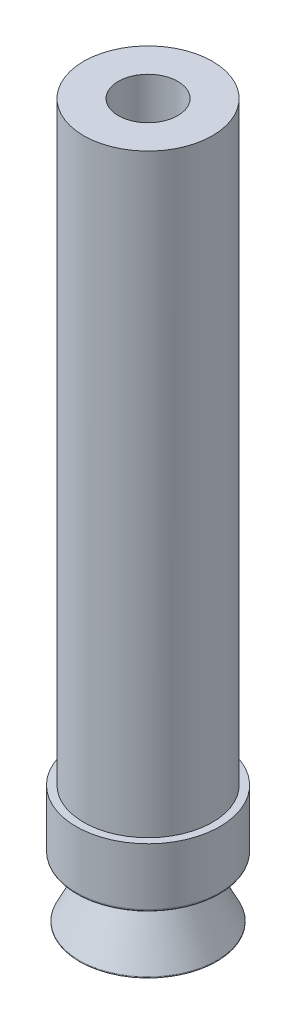
ISO-10303-21;
HEADER;
FILE_DESCRIPTION(('STEP AP214'),'2;1');
FILE_NAME('part.step','',(''),(''),'','','');
FILE_SCHEMA(('AUTOMOTIVE_DESIGN { 1 0 10303 214 1 1 1 1 }'));
ENDSEC;
DATA;
#1=APPLICATION_CONTEXT('core data for automotive mechanical design processes');
#2=APPLICATION_PROTOCOL_DEFINITION('international standard','automotive_design',2000,#1);
#3=PRODUCT_CONTEXT('',#1,'mechanical');
#4=PRODUCT('Part','Part','',(#3));
#5=PRODUCT_RELATED_PRODUCT_CATEGORY('part','',(#4));
#6=PRODUCT_DEFINITION_FORMATION('','',#4);
#7=PRODUCT_DEFINITION_CONTEXT('part definition',#1,'design');
#8=PRODUCT_DEFINITION('design','',#6,#7);
#9=PRODUCT_DEFINITION_SHAPE('','',#8);
#10=(LENGTH_UNIT() NAMED_UNIT(*) SI_UNIT(.MILLI.,.METRE.));
#11=(NAMED_UNIT(*) PLANE_ANGLE_UNIT() SI_UNIT($,.RADIAN.));
#12=(NAMED_UNIT(*) SI_UNIT($,.STERADIAN.) SOLID_ANGLE_UNIT());
#13=UNCERTAINTY_MEASURE_WITH_UNIT(LENGTH_MEASURE(1.E-05),#10,'distance_accuracy_value','');
#14=(GEOMETRIC_REPRESENTATION_CONTEXT(3) GLOBAL_UNCERTAINTY_ASSIGNED_CONTEXT((#13)) GLOBAL_UNIT_ASSIGNED_CONTEXT((#10,
#11,#12)) REPRESENTATION_CONTEXT('',''));
#15=CARTESIAN_POINT('',(0.,0.,0.));
#16=DIRECTION('',(0.,0.,1.));
#17=DIRECTION('',(1.,0.,0.));
#18=AXIS2_PLACEMENT_3D('',#15,#16,#17);
#19=CARTESIAN_POINT('',(0.,-6.,0.));
#20=DIRECTION('',(0.,-1.,0.));
#21=DIRECTION('',(0.,0.,-1.));
#22=AXIS2_PLACEMENT_3D('',#19,#20,#21);
#23=PLANE('',#22);
#24=CARTESIAN_POINT('',(0.,-6.,0.));
#25=DIRECTION('',(0.,-1.,0.));
#26=DIRECTION('',(0.,0.,-1.));
#27=AXIS2_PLACEMENT_3D('',#24,#25,#26);
#28=CIRCLE('',#27,4.40450849718748);
#29=CARTESIAN_POINT('',(0.,-6.,-4.40450849718748));
#30=VERTEX_POINT('',#29);
#31=EDGE_CURVE('E42',#30,#30,#28,.F.);
#32=ORIENTED_EDGE('',*,*,#31,.T.);
#33=EDGE_LOOP('',(#32));
#34=FACE_BOUND('',#33,.T.);
#35=CARTESIAN_POINT('',(0.,-6.,0.));
#36=DIRECTION('',(0.,-1.,0.));
#37=DIRECTION('',(0.,0.,-1.));
#38=AXIS2_PLACEMENT_3D('',#35,#36,#37);
#39=CIRCLE('',#38,7.);
#40=CARTESIAN_POINT('',(0.,-6.,-7.));
#41=VERTEX_POINT('',#40);
#42=EDGE_CURVE('E50',#41,#41,#39,.T.);
#43=ORIENTED_EDGE('',*,*,#42,.T.);
#44=EDGE_LOOP('',(#43));
#45=FACE_BOUND('',#44,.T.);
#46=ADVANCED_FACE('F35',(#34,#45),#23,.T.);
#47=CARTESIAN_POINT('',(0.,60.,0.));
#48=DIRECTION('',(0.,-1.,0.));
#49=DIRECTION('',(0.,0.,-1.));
#50=AXIS2_PLACEMENT_3D('',#47,#48,#49);
#51=CYLINDRICAL_SURFACE('',#50,6.5);
#52=CARTESIAN_POINT('',(0.,60.,0.));
#53=DIRECTION('',(0.,1.,0.));
#54=DIRECTION('',(0.,0.,1.));
#55=AXIS2_PLACEMENT_3D('',#52,#53,#54);
#56=CIRCLE('',#55,6.5);
#57=CARTESIAN_POINT('',(0.,60.,6.5));
#58=VERTEX_POINT('',#57);
#59=EDGE_CURVE('E67',#58,#58,#56,.T.);
#60=ORIENTED_EDGE('',*,*,#59,.F.);
#61=EDGE_LOOP('',(#60));
#62=FACE_BOUND('',#61,.T.);
#63=CARTESIAN_POINT('',(0.,0.,0.));
#64=DIRECTION('',(0.,-1.,0.));
#65=DIRECTION('',(0.,0.,-1.));
#66=AXIS2_PLACEMENT_3D('',#63,#64,#65);
#67=CIRCLE('',#66,6.5);
#68=CARTESIAN_POINT('',(0.,0.,-6.5));
#69=VERTEX_POINT('',#68);
#70=EDGE_CURVE('E74',#69,#69,#67,.T.);
#71=ORIENTED_EDGE('',*,*,#70,.F.);
#72=EDGE_LOOP('',(#71));
#73=FACE_BOUND('',#72,.T.);
#74=ADVANCED_FACE('F107',(#62,#73),#51,.T.);
#75=CARTESIAN_POINT('',(0.,60.,0.));
#76=DIRECTION('',(0.,1.,0.));
#77=DIRECTION('',(0.,0.,1.));
#78=AXIS2_PLACEMENT_3D('',#75,#76,#77);
#79=PLANE('',#78);
#80=CARTESIAN_POINT('',(0.,60.,0.));
#81=DIRECTION('',(0.,1.,0.));
#82=DIRECTION('',(0.,0.,1.));
#83=AXIS2_PLACEMENT_3D('',#80,#81,#82);
#84=CIRCLE('',#83,3.);
#85=CARTESIAN_POINT('',(0.,60.,3.));
#86=VERTEX_POINT('',#85);
#87=EDGE_CURVE('E71',#86,#86,#84,.T.);
#88=ORIENTED_EDGE('',*,*,#87,.F.);
#89=EDGE_LOOP('',(#88));
#90=FACE_BOUND('',#89,.T.);
#91=ORIENTED_EDGE('',*,*,#59,.T.);
#92=EDGE_LOOP('',(#91));
#93=FACE_BOUND('',#92,.T.);
#94=ADVANCED_FACE('F113',(#90,#93),#79,.T.);
#95=CARTESIAN_POINT('',(0.,7.5,0.));
#96=DIRECTION('',(0.,1.,0.));
#97=DIRECTION('',(0.,0.,1.));
#98=AXIS2_PLACEMENT_3D('',#95,#96,#97);
#99=CYLINDRICAL_SURFACE('',#98,3.);
#100=CARTESIAN_POINT('',(0.,7.5,0.));
#101=DIRECTION('',(0.,1.,0.));
#102=DIRECTION('',(0.,0.,1.));
#103=AXIS2_PLACEMENT_3D('',#100,#101,#102);
#104=CIRCLE('',#103,3.);
#105=CARTESIAN_POINT('',(0.,7.5,3.));
#106=VERTEX_POINT('',#105);
#107=EDGE_CURVE('E70',#106,#106,#104,.T.);
#108=ORIENTED_EDGE('',*,*,#107,.F.);
#109=EDGE_LOOP('',(#108));
#110=FACE_BOUND('',#109,.T.);
#111=ORIENTED_EDGE('',*,*,#87,.T.);
#112=EDGE_LOOP('',(#111));
#113=FACE_BOUND('',#112,.T.);
#114=ADVANCED_FACE('F132',(#110,#113),#99,.F.);
#115=CARTESIAN_POINT('',(0.,7.5,0.));
#116=DIRECTION('',(0.,1.,0.));
#117=DIRECTION('',(0.,0.,1.));
#118=AXIS2_PLACEMENT_3D('',#115,#116,#117);
#119=PLANE('',#118);
#120=ORIENTED_EDGE('',*,*,#107,.T.);
#121=EDGE_LOOP('',(#120));
#122=FACE_BOUND('',#121,.T.);
#123=ADVANCED_FACE('F136',(#122),#119,.T.);
#124=CARTESIAN_POINT('',(0.,0.,0.));
#125=DIRECTION('',(0.,-1.,0.));
#126=DIRECTION('',(0.,0.,-1.));
#127=AXIS2_PLACEMENT_3D('',#124,#125,#126);
#128=PLANE('',#127);
#129=CARTESIAN_POINT('',(0.,0.,0.));
#130=DIRECTION('',(0.,-1.,0.));
#131=DIRECTION('',(0.,0.,-1.));
#132=AXIS2_PLACEMENT_3D('',#129,#130,#131);
#133=CIRCLE('',#132,7.25);
#134=CARTESIAN_POINT('',(0.,0.,-7.25));
#135=VERTEX_POINT('',#134);
#136=EDGE_CURVE('E79',#135,#135,#133,.T.);
#137=ORIENTED_EDGE('',*,*,#136,.F.);
#138=EDGE_LOOP('',(#137));
#139=FACE_BOUND('',#138,.T.);
#140=ORIENTED_EDGE('',*,*,#70,.T.);
#141=EDGE_LOOP('',(#140));
#142=FACE_BOUND('',#141,.T.);
#143=ADVANCED_FACE('F140',(#139,#142),#128,.F.);
#144=CARTESIAN_POINT('',(0.,-6.,0.));
#145=DIRECTION('',(0.,1.,0.));
#146=DIRECTION('',(0.,0.,1.));
#147=AXIS2_PLACEMENT_3D('',#144,#145,#146);
#148=CYLINDRICAL_SURFACE('',#147,7.25);
#149=CARTESIAN_POINT('',(0.,-5.75,0.));
#150=DIRECTION('',(0.,-1.,0.));
#151=DIRECTION('',(0.,0.,-1.));
#152=AXIS2_PLACEMENT_3D('',#149,#150,#151);
#153=CIRCLE('',#152,7.25);
#154=CARTESIAN_POINT('',(0.,-5.75,-7.25));
#155=VERTEX_POINT('',#154);
#156=EDGE_CURVE('E46',#155,#155,#153,.F.);
#157=ORIENTED_EDGE('',*,*,#156,.T.);
#158=EDGE_LOOP('',(#157));
#159=FACE_BOUND('',#158,.T.);
#160=ORIENTED_EDGE('',*,*,#136,.T.);
#161=EDGE_LOOP('',(#160));
#162=FACE_BOUND('',#161,.T.);
#163=ADVANCED_FACE('F142',(#159,#162),#148,.T.);
#164=CARTESIAN_POINT('',(0.,-12.,0.));
#165=DIRECTION('',(0.,-1.,0.));
#166=DIRECTION('',(0.,0.,-1.));
#167=AXIS2_PLACEMENT_3D('',#164,#165,#166);
#168=CONICAL_SURFACE('',#167,7.,0.463647609000806);
#169=CARTESIAN_POINT('',(0.,-6.36180339887499,0.));
#170=DIRECTION('',(0.,1.,0.));
#171=DIRECTION('',(0.,0.,1.));
#172=AXIS2_PLACEMENT_3D('',#169,#170,#171);
#173=CIRCLE('',#172,4.1809016994375);
#174=CARTESIAN_POINT('',(0.,-6.36180339887499,4.1809016994375));
#175=VERTEX_POINT('',#174);
#176=EDGE_CURVE('E10',#175,#175,#173,.F.);
#177=ORIENTED_EDGE('',*,*,#176,.T.);
#178=EDGE_LOOP('',(#177));
#179=FACE_BOUND('',#178,.T.);
#180=CARTESIAN_POINT('',(0.,-11.85527864045,0.));
#181=DIRECTION('',(0.,1.,0.));
#182=DIRECTION('',(0.,0.,1.));
#183=AXIS2_PLACEMENT_3D('',#180,#181,#182);
#184=CIRCLE('',#183,6.927639320225);
#185=CARTESIAN_POINT('',(0.,-11.85527864045,6.927639320225));
#186=VERTEX_POINT('',#185);
#187=EDGE_CURVE('E55',#186,#186,#184,.T.);
#188=ORIENTED_EDGE('',*,*,#187,.T.);
#189=EDGE_LOOP('',(#188));
#190=FACE_BOUND('',#189,.T.);
#191=ADVANCED_FACE('F144',(#179,#190),#168,.T.);
#192=CARTESIAN_POINT('',(0.,-12.,-6.75));
#193=DIRECTION('',(0.,1.,0.));
#194=DIRECTION('',(0.,0.,1.));
#195=AXIS2_PLACEMENT_3D('',#192,#193,#194);
#196=PLANE('',#195);
#197=CARTESIAN_POINT('',(0.,-12.,0.));
#198=DIRECTION('',(0.,1.,0.));
#199=DIRECTION('',(0.,0.,1.));
#200=AXIS2_PLACEMENT_3D('',#197,#198,#199);
#201=CIRCLE('',#200,6.79267308448829);
#202=CARTESIAN_POINT('',(0.,-12.,6.79267308448829));
#203=VERTEX_POINT('',#202);
#204=EDGE_CURVE('E61',#203,#203,#201,.T.);
#205=ORIENTED_EDGE('',*,*,#204,.T.);
#206=EDGE_LOOP('',(#205));
#207=FACE_BOUND('',#206,.T.);
#208=CARTESIAN_POINT('',(0.,-12.,0.));
#209=DIRECTION('',(0.,1.,0.));
#210=DIRECTION('',(0.,0.,1.));
#211=AXIS2_PLACEMENT_3D('',#208,#209,#210);
#212=CIRCLE('',#211,6.83819660112501);
#213=CARTESIAN_POINT('',(0.,-12.,6.83819660112501));
#214=VERTEX_POINT('',#213);
#215=EDGE_CURVE('E64',#214,#214,#212,.F.);
#216=ORIENTED_EDGE('',*,*,#215,.T.);
#217=EDGE_LOOP('',(#216));
#218=FACE_BOUND('',#217,.T.);
#219=ADVANCED_FACE('F101',(#207,#218),#196,.F.);
#220=CARTESIAN_POINT('',(0.,-6.,0.));
#221=DIRECTION('',(0.,-1.,0.));
#222=DIRECTION('',(0.,0.,-1.));
#223=AXIS2_PLACEMENT_3D('',#220,#221,#222);
#224=CONICAL_SURFACE('',#223,1.,0.764124777373387);
#225=CARTESIAN_POINT('',(0.,-11.9691905363236,0.));
#226=DIRECTION('',(0.,1.,0.));
#227=DIRECTION('',(0.,0.,1.));
#228=AXIS2_PLACEMENT_3D('',#225,#226,#227);
#229=CIRCLE('',#228,6.72047426397675);
#230=CARTESIAN_POINT('',(0.,-11.9691905363236,-6.72047426397675));
#231=VERTEX_POINT('',#230);
#232=EDGE_CURVE('E58',#231,#231,#229,.F.);
#233=CARTESIAN_POINT('',(0.,-6.,0.));
#234=DIRECTION('',(0.,1.,0.));
#235=DIRECTION('',(0.,0.,1.));
#236=AXIS2_PLACEMENT_3D('',#233,#234,#235);
#237=CIRCLE('',#236,1.);
#238=CARTESIAN_POINT('',(0.,-6.,-1.));
#239=VERTEX_POINT('',#238);
#240=EDGE_CURVE('E82',#239,#239,#237,.T.);
#241=CARTESIAN_POINT('',(0.,-11.9691905363236,-6.72047426397675));
#242=CARTESIAN_POINT('',(0.,-11.9070114682369,-6.66088599039366));
#243=CARTESIAN_POINT('',(0.,-11.8448324001502,-6.60129771681057));
#244=CARTESIAN_POINT('',(0.,-11.7204742639767,-6.48212116964438));
#245=CARTESIAN_POINT('',(0.,-11.65829519589,-6.42253289606129));
#246=CARTESIAN_POINT('',(0.,-11.5339370597166,-6.30335634889511));
#247=CARTESIAN_POINT('',(0.,-11.4717579916299,-6.24376807531202));
#248=CARTESIAN_POINT('',(0.,-11.3473998554565,-6.12459152814584));
#249=CARTESIAN_POINT('',(0.,-11.2852207873698,-6.06500325456275));
#250=CARTESIAN_POINT('',(0.,-11.1608626511964,-5.94582670739656));
#251=CARTESIAN_POINT('',(0.,-11.0986835831097,-5.88623843381347));
#252=CARTESIAN_POINT('',(0.,-10.9743254469363,-5.76706188664729));
#253=CARTESIAN_POINT('',(0.,-10.9121463788496,-5.7074736130642));
#254=CARTESIAN_POINT('',(0.,-10.7877882426762,-5.58829706589802));
#255=CARTESIAN_POINT('',(0.,-10.7256091745895,-5.52870879231493));
#256=CARTESIAN_POINT('',(0.,-10.6012510384161,-5.40953224514874));
#257=CARTESIAN_POINT('',(0.,-10.5390719703294,-5.34994397156565));
#258=CARTESIAN_POINT('',(0.,-10.414713834156,-5.23076742439947));
#259=CARTESIAN_POINT('',(0.,-10.3525347660693,-5.17117915081638));
#260=CARTESIAN_POINT('',(0.,-10.2281766298959,-5.0520026036502));
#261=CARTESIAN_POINT('',(0.,-10.1659975618092,-4.9924143300671));
#262=CARTESIAN_POINT('',(0.,-10.0416394256357,-4.87323778290092));
#263=CARTESIAN_POINT('',(0.,-9.97946035754904,-4.81364950931783));
#264=CARTESIAN_POINT('',(0.,-9.85510222137563,-4.69447296215165));
#265=CARTESIAN_POINT('',(0.,-9.79292315328893,-4.63488468856856));
#266=CARTESIAN_POINT('',(0.,-9.66856501711552,-4.51570814140238));
#267=CARTESIAN_POINT('',(0.,-9.60638594902882,-4.45611986781929));
#268=CARTESIAN_POINT('',(0.,-9.48202781285541,-4.3369433206531));
#269=CARTESIAN_POINT('',(0.,-9.41984874476871,-4.27735504707001));
#270=CARTESIAN_POINT('',(0.,-9.2954906085953,-4.15817849990383));
#271=CARTESIAN_POINT('',(0.,-9.23331154050859,-4.09859022632074));
#272=CARTESIAN_POINT('',(0.,-9.10895340433519,-3.97941367915456));
#273=CARTESIAN_POINT('',(0.,-9.04677433624848,-3.91982540557147));
#274=CARTESIAN_POINT('',(0.,-8.92241620007507,-3.80064885840528));
#275=CARTESIAN_POINT('',(0.,-8.86023713198837,-3.74106058482219));
#276=CARTESIAN_POINT('',(0.,-8.73587899581496,-3.62188403765601));
#277=CARTESIAN_POINT('',(0.,-8.67369992772826,-3.56229576407292));
#278=CARTESIAN_POINT('',(0.,-8.54934179155485,-3.44311921690674));
#279=CARTESIAN_POINT('',(0.,-8.48716272346815,-3.38353094332364));
#280=CARTESIAN_POINT('',(0.,-8.36280458729474,-3.26435439615746));
#281=CARTESIAN_POINT('',(0.,-8.30062551920804,-3.20476612257437));
#282=CARTESIAN_POINT('',(0.,-8.17626738303463,-3.08558957540819));
#283=CARTESIAN_POINT('',(0.,-8.11408831494793,-3.0260013018251));
#284=CARTESIAN_POINT('',(0.,-7.98973017877452,-2.90682475465892));
#285=CARTESIAN_POINT('',(0.,-7.92755111068782,-2.84723648107582));
#286=CARTESIAN_POINT('',(0.,-7.80319297451441,-2.72805993390964));
#287=CARTESIAN_POINT('',(0.,-7.7410139064277,-2.66847166032655));
#288=CARTESIAN_POINT('',(0.,-7.6166557702543,-2.54929511316037));
#289=CARTESIAN_POINT('',(0.,-7.55447670216759,-2.48970683957728));
#290=CARTESIAN_POINT('',(0.,-7.43011856599419,-2.3705302924111));
#291=CARTESIAN_POINT('',(0.,-7.36793949790748,-2.310942018828));
#292=CARTESIAN_POINT('',(0.,-7.24358136173407,-2.19176547166182));
#293=CARTESIAN_POINT('',(0.,-7.18140229364737,-2.13217719807873));
#294=CARTESIAN_POINT('',(0.,-7.05704415747396,-2.01300065091255));
#295=CARTESIAN_POINT('',(0.,-6.99486508938726,-1.95341237732946));
#296=CARTESIAN_POINT('',(0.,-6.87050695321385,-1.83423583016328));
#297=CARTESIAN_POINT('',(0.,-6.80832788512715,-1.77464755658018));
#298=CARTESIAN_POINT('',(0.,-6.68396974895374,-1.655471009414));
#299=CARTESIAN_POINT('',(0.,-6.62179068086704,-1.59588273583091));
#300=CARTESIAN_POINT('',(0.,-6.49743254469363,-1.47670618866473));
#301=CARTESIAN_POINT('',(0.,-6.43525347660692,-1.41711791508164));
#302=CARTESIAN_POINT('',(0.,-6.31089534043352,-1.29794136791546));
#303=CARTESIAN_POINT('',(0.,-6.24871627234681,-1.23835309433236));
#304=CARTESIAN_POINT('',(0.,-6.12435813617341,-1.11917654716618));
#305=CARTESIAN_POINT('',(0.,-6.0621790680867,-1.05958827358309));
#306=CARTESIAN_POINT('',(0.,-6.,-1.));
#307=B_SPLINE_CURVE_WITH_KNOTS('',3,(#241,#242,#243,#244,#245,#246,#247,#248,#249,#250,#251,
#252,#253,#254,#255,#256,#257,#258,#259,#260,#261,#262,#263,#264,#265,#266,#267,#268,#269,#270,
#271,#272,#273,#274,#275,#276,#277,#278,#279,#280,#281,#282,#283,#284,#285,#286,#287,#288,#289,
#290,#291,#292,#293,#294,#295,#296,#297,#298,#299,#300,#301,#302,#303,#304,#305,#306),
.UNSPECIFIED.,.F.,.F.,(4,2,2,2,2,2,2,2,2,2,2,2,2,2,2,2,2,2,2,2,2,2,2,2,2,2,2,2,2,2,2,2,4),(0.,
0.258365999525283,0.516731999050567,0.775097998575847,1.03346399810113,1.29182999762641,
1.5501959971517,1.80856199667698,2.06692799620226,2.32529399572755,2.58365999525283,
2.84202599477811,3.10039199430339,3.35875799382867,3.61712399335396,3.87548999287924,
4.13385599240452,4.39222199192981,4.65058799145509,4.90895399098037,5.16731999050565,
5.42568599003094,5.68405198955622,5.9424179890815,6.20078398860678,6.45914998813207,
6.71751598765735,6.97588198718263,7.23424798670791,7.4926139862332,7.75097998575848,
8.00934598528376,8.26771198480905),.UNSPECIFIED.);
#308=EDGE_CURVE('BSEAM86',#231,#239,#307,.T.);
#309=ORIENTED_EDGE('',*,*,#232,.T.);
#310=ORIENTED_EDGE('',*,*,#240,.T.);
#311=ORIENTED_EDGE('',*,*,#308,.T.);
#312=ORIENTED_EDGE('',*,*,#308,.F.);
#313=EDGE_LOOP('',(#309,#311,#310,#312));
#314=FACE_BOUND('',#313,.T.);
#315=ADVANCED_FACE('F86',(#314),#224,.F.);
#316=ORIENTED_EDGE('',*,*,#240,.F.);
#317=EDGE_LOOP('',(#316));
#318=FACE_BOUND('',#317,.T.);
#319=ADVANCED_FACE('F88',(#318),#23,.T.);
#320=CARTESIAN_POINT('',(0.,-11.9,0.));
#321=DIRECTION('',(0.,1.,0.));
#322=DIRECTION('',(0.,0.,1.));
#323=AXIS2_PLACEMENT_3D('',#320,#321,#322);
#324=TOROIDAL_SURFACE('',#323,6.79267308448829,0.1);
#325=ORIENTED_EDGE('',*,*,#232,.F.);
#326=EDGE_LOOP('',(#325));
#327=FACE_BOUND('',#326,.T.);
#328=ORIENTED_EDGE('',*,*,#204,.F.);
#329=EDGE_LOOP('',(#328));
#330=FACE_BOUND('',#329,.T.);
#331=ADVANCED_FACE('F90',(#327,#330),#324,.T.);
#332=CARTESIAN_POINT('',(0.,-11.9,0.));
#333=DIRECTION('',(0.,1.,0.));
#334=DIRECTION('',(0.,0.,1.));
#335=AXIS2_PLACEMENT_3D('',#332,#333,#334);
#336=TOROIDAL_SURFACE('',#335,6.83819660112501,0.1);
#337=ORIENTED_EDGE('',*,*,#215,.F.);
#338=EDGE_LOOP('',(#337));
#339=FACE_BOUND('',#338,.T.);
#340=ORIENTED_EDGE('',*,*,#187,.F.);
#341=EDGE_LOOP('',(#340));
#342=FACE_BOUND('',#341,.T.);
#343=ADVANCED_FACE('F97',(#339,#342),#336,.T.);
#344=CARTESIAN_POINT('',(0.,-5.75,0.));
#345=DIRECTION('',(0.,-1.,0.));
#346=DIRECTION('',(0.,0.,-1.));
#347=AXIS2_PLACEMENT_3D('',#344,#345,#346);
#348=TOROIDAL_SURFACE('',#347,7.,0.25);
#349=ORIENTED_EDGE('',*,*,#156,.F.);
#350=EDGE_LOOP('',(#349));
#351=FACE_BOUND('',#350,.T.);
#352=ORIENTED_EDGE('',*,*,#42,.F.);
#353=EDGE_LOOP('',(#352));
#354=FACE_BOUND('',#353,.T.);
#355=ADVANCED_FACE('F119',(#351,#354),#348,.T.);
#356=CARTESIAN_POINT('',(0.,-6.25,0.));
#357=DIRECTION('',(0.,-1.,0.));
#358=DIRECTION('',(0.,0.,-1.));
#359=AXIS2_PLACEMENT_3D('',#356,#357,#358);
#360=TOROIDAL_SURFACE('',#359,4.40450849718748,0.25);
#361=ORIENTED_EDGE('',*,*,#176,.F.);
#362=EDGE_LOOP('',(#361));
#363=FACE_BOUND('',#362,.T.);
#364=ORIENTED_EDGE('',*,*,#31,.F.);
#365=EDGE_LOOP('',(#364));
#366=FACE_BOUND('',#365,.T.);
#367=ADVANCED_FACE('F37',(#363,#366),#360,.F.);
#368=CLOSED_SHELL('',(#46,#74,#94,#114,#123,#143,#163,#191,#219,#315,#319,#331,#343,#355,#367));
#369=MANIFOLD_SOLID_BREP('B2',#368);
#370=ADVANCED_BREP_SHAPE_REPRESENTATION('',(#18,#369),#14);
#371=SHAPE_DEFINITION_REPRESENTATION(#9,#370);
ENDSEC;
END-ISO-10303-21;
